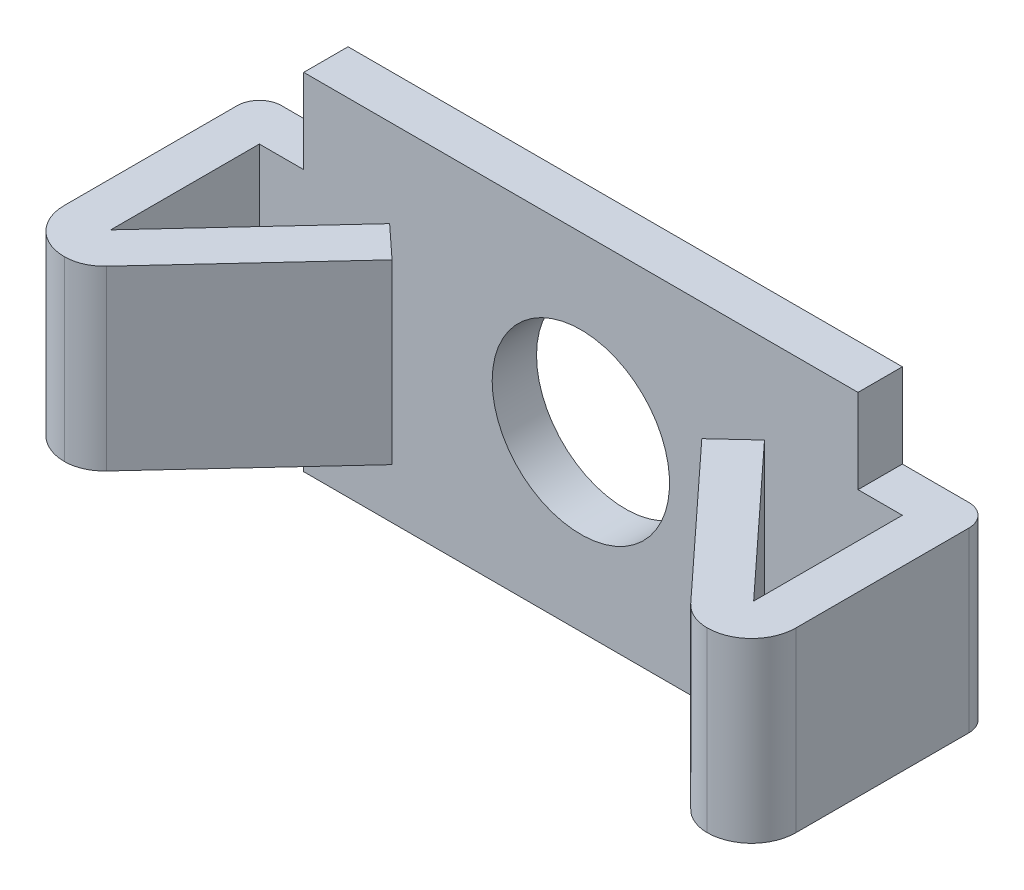
ISO-10303-21;
HEADER;
FILE_DESCRIPTION(('STEP AP214'),'2;1');
FILE_NAME('part.step','',(''),(''),'','','');
FILE_SCHEMA(('AUTOMOTIVE_DESIGN { 1 0 10303 214 1 1 1 1 }'));
ENDSEC;
DATA;
#1=APPLICATION_CONTEXT('core data for automotive mechanical design processes');
#2=APPLICATION_PROTOCOL_DEFINITION('international standard','automotive_design',2000,#1);
#3=PRODUCT_CONTEXT('',#1,'mechanical');
#4=PRODUCT('Part','Part','',(#3));
#5=PRODUCT_RELATED_PRODUCT_CATEGORY('part','',(#4));
#6=PRODUCT_DEFINITION_FORMATION('','',#4);
#7=PRODUCT_DEFINITION_CONTEXT('part definition',#1,'design');
#8=PRODUCT_DEFINITION('design','',#6,#7);
#9=PRODUCT_DEFINITION_SHAPE('','',#8);
#10=(LENGTH_UNIT() NAMED_UNIT(*) SI_UNIT(.MILLI.,.METRE.));
#11=(NAMED_UNIT(*) PLANE_ANGLE_UNIT() SI_UNIT($,.RADIAN.));
#12=(NAMED_UNIT(*) SI_UNIT($,.STERADIAN.) SOLID_ANGLE_UNIT());
#13=UNCERTAINTY_MEASURE_WITH_UNIT(LENGTH_MEASURE(1.E-05),#10,'distance_accuracy_value','');
#14=(GEOMETRIC_REPRESENTATION_CONTEXT(3) GLOBAL_UNCERTAINTY_ASSIGNED_CONTEXT((#13)) GLOBAL_UNIT_ASSIGNED_CONTEXT((#10,
#11,#12)) REPRESENTATION_CONTEXT('',''));
#15=CARTESIAN_POINT('',(0.,0.,0.));
#16=DIRECTION('',(0.,0.,1.));
#17=DIRECTION('',(1.,0.,0.));
#18=AXIS2_PLACEMENT_3D('',#15,#16,#17);
#19=CARTESIAN_POINT('',(14.5,4.,0.));
#20=DIRECTION('',(-1.,0.,0.));
#21=DIRECTION('',(0.,0.,-1.));
#22=AXIS2_PLACEMENT_3D('',#19,#20,#21);
#23=PLANE('',#22);
#24=DIRECTION('',(0.,0.,1.));
#25=VECTOR('',#24,1.);
#26=CARTESIAN_POINT('',(14.5,-4.,10.8));
#27=LINE('',#26,#25);
#28=CARTESIAN_POINT('',(14.5,-4.,2.));
#29=VERTEX_POINT('',#28);
#30=CARTESIAN_POINT('',(14.5,-4.,8.70715298939121));
#31=VERTEX_POINT('',#30);
#32=EDGE_CURVE('E255',#29,#31,#27,.T.);
#33=ORIENTED_EDGE('',*,*,#32,.T.);
#34=DIRECTION('',(0.,1.,0.));
#35=VECTOR('',#34,1.);
#36=CARTESIAN_POINT('',(14.5,-4.,8.70715298939121));
#37=LINE('',#36,#35);
#38=CARTESIAN_POINT('',(14.5,4.,8.70715298939121));
#39=VERTEX_POINT('',#38);
#40=EDGE_CURVE('E230',#31,#39,#37,.T.);
#41=ORIENTED_EDGE('',*,*,#40,.T.);
#42=DIRECTION('',(0.,0.,-1.));
#43=VECTOR('',#42,1.);
#44=CARTESIAN_POINT('',(14.5,4.,0.));
#45=LINE('',#44,#43);
#46=CARTESIAN_POINT('',(14.5,4.,2.));
#47=VERTEX_POINT('',#46);
#48=EDGE_CURVE('E248',#39,#47,#45,.T.);
#49=ORIENTED_EDGE('',*,*,#48,.T.);
#50=DIRECTION('',(0.,1.,0.));
#51=VECTOR('',#50,1.);
#52=CARTESIAN_POINT('',(14.5,7.8,2.));
#53=LINE('',#52,#51);
#54=EDGE_CURVE('E257',#29,#47,#53,.T.);
#55=ORIENTED_EDGE('',*,*,#54,.F.);
#56=EDGE_LOOP('',(#33,#41,#49,#55));
#57=FACE_BOUND('',#56,.T.);
#58=ADVANCED_FACE('F35',(#57),#23,.T.);
#59=CARTESIAN_POINT('',(16.5,-7.80000000000001,2.));
#60=DIRECTION('',(-1.,0.,0.));
#61=DIRECTION('',(0.,0.,1.));
#62=AXIS2_PLACEMENT_3D('',#59,#60,#61);
#63=PLANE('',#62);
#64=DIRECTION('',(0.,0.,1.));
#65=VECTOR('',#64,1.);
#66=CARTESIAN_POINT('',(16.5,-4.,0.));
#67=LINE('',#66,#65);
#68=CARTESIAN_POINT('',(16.5,-4.,1.));
#69=VERTEX_POINT('',#68);
#70=CARTESIAN_POINT('',(16.5,-4.,8.8));
#71=VERTEX_POINT('',#70);
#72=EDGE_CURVE('E314',#69,#71,#67,.T.);
#73=ORIENTED_EDGE('',*,*,#72,.F.);
#74=DIRECTION('',(0.,1.,0.));
#75=VECTOR('',#74,1.);
#76=CARTESIAN_POINT('',(16.5,4.,1.));
#77=LINE('',#76,#75);
#78=CARTESIAN_POINT('',(16.5,4.,1.));
#79=VERTEX_POINT('',#78);
#80=EDGE_CURVE('E404',#69,#79,#77,.T.);
#81=ORIENTED_EDGE('',*,*,#80,.T.);
#82=DIRECTION('',(0.,0.,1.));
#83=VECTOR('',#82,1.);
#84=CARTESIAN_POINT('',(16.5,4.,0.));
#85=LINE('',#84,#83);
#86=CARTESIAN_POINT('',(16.5,4.,8.8));
#87=VERTEX_POINT('',#86);
#88=EDGE_CURVE('E337',#79,#87,#85,.T.);
#89=ORIENTED_EDGE('',*,*,#88,.T.);
#90=DIRECTION('',(0.,1.,0.));
#91=VECTOR('',#90,1.);
#92=CARTESIAN_POINT('',(16.5,-7.80000000000001,8.8));
#93=LINE('',#92,#91);
#94=EDGE_CURVE('E391',#87,#71,#93,.F.);
#95=ORIENTED_EDGE('',*,*,#94,.T.);
#96=EDGE_LOOP('',(#73,#81,#89,#95));
#97=FACE_BOUND('',#96,.T.);
#98=ADVANCED_FACE('F488',(#97),#63,.F.);
#99=CARTESIAN_POINT('',(-16.5,7.8,2.));
#100=DIRECTION('',(0.,-1.,0.));
#101=DIRECTION('',(0.,0.,-1.));
#102=AXIS2_PLACEMENT_3D('',#99,#100,#101);
#103=PLANE('',#102);
#104=DIRECTION('',(-1.,0.,0.));
#105=VECTOR('',#104,1.);
#106=CARTESIAN_POINT('',(-16.5,7.8,2.));
#107=LINE('',#106,#105);
#108=CARTESIAN_POINT('',(12.5,7.8,2.));
#109=VERTEX_POINT('',#108);
#110=CARTESIAN_POINT('',(-12.5,7.8,2.));
#111=VERTEX_POINT('',#110);
#112=EDGE_CURVE('E379',#109,#111,#107,.T.);
#113=ORIENTED_EDGE('',*,*,#112,.F.);
#114=DIRECTION('',(0.,0.,1.));
#115=VECTOR('',#114,1.);
#116=CARTESIAN_POINT('',(12.5,7.8,0.));
#117=LINE('',#116,#115);
#118=CARTESIAN_POINT('',(12.5,7.8,0.));
#119=VERTEX_POINT('',#118);
#120=EDGE_CURVE('E332',#119,#109,#117,.T.);
#121=ORIENTED_EDGE('',*,*,#120,.F.);
#122=DIRECTION('',(-1.,0.,0.));
#123=VECTOR('',#122,1.);
#124=CARTESIAN_POINT('',(-16.5,7.8,0.));
#125=LINE('',#124,#123);
#126=CARTESIAN_POINT('',(-12.5,7.8,0.));
#127=VERTEX_POINT('',#126);
#128=EDGE_CURVE('E374',#119,#127,#125,.T.);
#129=ORIENTED_EDGE('',*,*,#128,.T.);
#130=DIRECTION('',(0.,0.,1.));
#131=VECTOR('',#130,1.);
#132=CARTESIAN_POINT('',(-12.5,7.8,0.));
#133=LINE('',#132,#131);
#134=EDGE_CURVE('E371',#127,#111,#133,.T.);
#135=ORIENTED_EDGE('',*,*,#134,.T.);
#136=EDGE_LOOP('',(#113,#121,#129,#135));
#137=FACE_BOUND('',#136,.T.);
#138=ADVANCED_FACE('F469',(#137),#103,.F.);
#139=CARTESIAN_POINT('',(-16.5,-7.80000000000001,2.));
#140=DIRECTION('',(1.,0.,0.));
#141=DIRECTION('',(0.,0.,-1.));
#142=AXIS2_PLACEMENT_3D('',#139,#140,#141);
#143=PLANE('',#142);
#144=DIRECTION('',(0.,0.,1.));
#145=VECTOR('',#144,1.);
#146=CARTESIAN_POINT('',(-16.5,4.,0.));
#147=LINE('',#146,#145);
#148=CARTESIAN_POINT('',(-16.5,4.,1.));
#149=VERTEX_POINT('',#148);
#150=CARTESIAN_POINT('',(-16.5,4.,8.8));
#151=VERTEX_POINT('',#150);
#152=EDGE_CURVE('E367',#149,#151,#147,.T.);
#153=ORIENTED_EDGE('',*,*,#152,.F.);
#154=DIRECTION('',(0.,-1.,0.));
#155=VECTOR('',#154,1.);
#156=CARTESIAN_POINT('',(-16.5,-4.,1.));
#157=LINE('',#156,#155);
#158=CARTESIAN_POINT('',(-16.5,-4.,1.));
#159=VERTEX_POINT('',#158);
#160=EDGE_CURVE('E415',#149,#159,#157,.T.);
#161=ORIENTED_EDGE('',*,*,#160,.T.);
#162=DIRECTION('',(0.,0.,1.));
#163=VECTOR('',#162,1.);
#164=CARTESIAN_POINT('',(-16.5,-4.,0.));
#165=LINE('',#164,#163);
#166=CARTESIAN_POINT('',(-16.5,-4.,8.8));
#167=VERTEX_POINT('',#166);
#168=EDGE_CURVE('E355',#159,#167,#165,.T.);
#169=ORIENTED_EDGE('',*,*,#168,.T.);
#170=DIRECTION('',(0.,1.,0.));
#171=VECTOR('',#170,1.);
#172=CARTESIAN_POINT('',(-16.5,4.,8.8));
#173=LINE('',#172,#171);
#174=EDGE_CURVE('E396',#167,#151,#173,.T.);
#175=ORIENTED_EDGE('',*,*,#174,.T.);
#176=EDGE_LOOP('',(#153,#161,#169,#175));
#177=FACE_BOUND('',#176,.T.);
#178=ADVANCED_FACE('F425',(#177),#143,.F.);
#179=CARTESIAN_POINT('',(-16.5,-7.80000000000001,2.));
#180=DIRECTION('',(0.,1.,0.));
#181=DIRECTION('',(0.,0.,1.));
#182=AXIS2_PLACEMENT_3D('',#179,#180,#181);
#183=PLANE('',#182);
#184=DIRECTION('',(1.,0.,0.));
#185=VECTOR('',#184,1.);
#186=CARTESIAN_POINT('',(-16.5,-7.80000000000001,0.));
#187=LINE('',#186,#185);
#188=CARTESIAN_POINT('',(-12.5,-7.80000000000001,0.));
#189=VERTEX_POINT('',#188);
#190=CARTESIAN_POINT('',(12.5,-7.80000000000001,0.));
#191=VERTEX_POINT('',#190);
#192=EDGE_CURVE('E382',#189,#191,#187,.T.);
#193=ORIENTED_EDGE('',*,*,#192,.T.);
#194=DIRECTION('',(0.,0.,1.));
#195=VECTOR('',#194,1.);
#196=CARTESIAN_POINT('',(12.5,-7.80000000000001,0.));
#197=LINE('',#196,#195);
#198=CARTESIAN_POINT('',(12.5,-7.80000000000001,2.));
#199=VERTEX_POINT('',#198);
#200=EDGE_CURVE('E317',#191,#199,#197,.T.);
#201=ORIENTED_EDGE('',*,*,#200,.T.);
#202=DIRECTION('',(1.,0.,0.));
#203=VECTOR('',#202,1.);
#204=CARTESIAN_POINT('',(-16.5,-7.80000000000001,2.));
#205=LINE('',#204,#203);
#206=CARTESIAN_POINT('',(-12.5,-7.80000000000001,2.));
#207=VERTEX_POINT('',#206);
#208=EDGE_CURVE('E381',#207,#199,#205,.T.);
#209=ORIENTED_EDGE('',*,*,#208,.F.);
#210=DIRECTION('',(0.,0.,1.));
#211=VECTOR('',#210,1.);
#212=CARTESIAN_POINT('',(-12.5,-7.80000000000001,0.));
#213=LINE('',#212,#211);
#214=EDGE_CURVE('E350',#189,#207,#213,.T.);
#215=ORIENTED_EDGE('',*,*,#214,.F.);
#216=EDGE_LOOP('',(#193,#201,#209,#215));
#217=FACE_BOUND('',#216,.T.);
#218=ADVANCED_FACE('F556',(#217),#183,.F.);
#219=CARTESIAN_POINT('',(16.5,7.8,2.));
#220=DIRECTION('',(0.,0.,-1.));
#221=DIRECTION('',(-1.,0.,0.));
#222=AXIS2_PLACEMENT_3D('',#219,#220,#221);
#223=PLANE('',#222);
#224=CARTESIAN_POINT('',(0.,0.,2.));
#225=DIRECTION('',(0.,0.,-1.));
#226=DIRECTION('',(-1.,0.,0.));
#227=AXIS2_PLACEMENT_3D('',#224,#225,#226);
#228=CIRCLE('',#227,4.);
#229=CARTESIAN_POINT('',(-4.,0.,2.));
#230=VERTEX_POINT('',#229);
#231=EDGE_CURVE('E263',#230,#230,#228,.T.);
#232=ORIENTED_EDGE('',*,*,#231,.T.);
#233=EDGE_LOOP('',(#232));
#234=FACE_BOUND('',#233,.T.);
#235=DIRECTION('',(-1.,0.,0.));
#236=VECTOR('',#235,1.);
#237=CARTESIAN_POINT('',(12.5,-4.,2.));
#238=LINE('',#237,#236);
#239=CARTESIAN_POINT('',(12.5,-4.,2.));
#240=VERTEX_POINT('',#239);
#241=EDGE_CURVE('E307',#29,#240,#238,.T.);
#242=ORIENTED_EDGE('',*,*,#241,.F.);
#243=ORIENTED_EDGE('',*,*,#54,.T.);
#244=DIRECTION('',(1.,0.,0.));
#245=VECTOR('',#244,1.);
#246=CARTESIAN_POINT('',(12.5,4.,2.));
#247=LINE('',#246,#245);
#248=CARTESIAN_POINT('',(12.5,4.,2.));
#249=VERTEX_POINT('',#248);
#250=EDGE_CURVE('E329',#249,#47,#247,.T.);
#251=ORIENTED_EDGE('',*,*,#250,.F.);
#252=DIRECTION('',(0.,-1.,0.));
#253=VECTOR('',#252,1.);
#254=CARTESIAN_POINT('',(12.5,7.8,2.));
#255=LINE('',#254,#253);
#256=EDGE_CURVE('E320',#109,#249,#255,.T.);
#257=ORIENTED_EDGE('',*,*,#256,.F.);
#258=ORIENTED_EDGE('',*,*,#112,.T.);
#259=DIRECTION('',(0.,1.,0.));
#260=VECTOR('',#259,1.);
#261=CARTESIAN_POINT('',(-12.5,7.8,2.));
#262=LINE('',#261,#260);
#263=CARTESIAN_POINT('',(-12.5,4.,2.));
#264=VERTEX_POINT('',#263);
#265=EDGE_CURVE('E364',#264,#111,#262,.T.);
#266=ORIENTED_EDGE('',*,*,#265,.F.);
#267=DIRECTION('',(1.,0.,0.));
#268=VECTOR('',#267,1.);
#269=CARTESIAN_POINT('',(-12.5,4.,2.));
#270=LINE('',#269,#268);
#271=CARTESIAN_POINT('',(-14.5,4.,2.));
#272=VERTEX_POINT('',#271);
#273=EDGE_CURVE('E357',#272,#264,#270,.T.);
#274=ORIENTED_EDGE('',*,*,#273,.F.);
#275=DIRECTION('',(0.,-1.,0.));
#276=VECTOR('',#275,1.);
#277=CARTESIAN_POINT('',(-14.5,7.8,2.));
#278=LINE('',#277,#276);
#279=CARTESIAN_POINT('',(-14.5,-4.,2.));
#280=VERTEX_POINT('',#279);
#281=EDGE_CURVE('E305',#272,#280,#278,.T.);
#282=ORIENTED_EDGE('',*,*,#281,.T.);
#283=DIRECTION('',(-1.,0.,0.));
#284=VECTOR('',#283,1.);
#285=CARTESIAN_POINT('',(-12.5,-4.,2.));
#286=LINE('',#285,#284);
#287=CARTESIAN_POINT('',(-12.5,-4.,2.));
#288=VERTEX_POINT('',#287);
#289=EDGE_CURVE('E347',#288,#280,#286,.T.);
#290=ORIENTED_EDGE('',*,*,#289,.F.);
#291=DIRECTION('',(0.,1.,0.));
#292=VECTOR('',#291,1.);
#293=CARTESIAN_POINT('',(-12.5,-4.,2.));
#294=LINE('',#293,#292);
#295=EDGE_CURVE('E339',#207,#288,#294,.T.);
#296=ORIENTED_EDGE('',*,*,#295,.F.);
#297=ORIENTED_EDGE('',*,*,#208,.T.);
#298=DIRECTION('',(0.,-1.,0.));
#299=VECTOR('',#298,1.);
#300=CARTESIAN_POINT('',(12.5,-4.,2.));
#301=LINE('',#300,#299);
#302=EDGE_CURVE('E311',#240,#199,#301,.T.);
#303=ORIENTED_EDGE('',*,*,#302,.F.);
#304=EDGE_LOOP('',(#242,#243,#251,#257,#258,#266,#274,#282,#290,#296,#297,#303));
#305=FACE_BOUND('',#304,.T.);
#306=ADVANCED_FACE('F456',(#234,#305),#223,.F.);
#307=CARTESIAN_POINT('',(16.5,7.8,0.));
#308=DIRECTION('',(0.,0.,-1.));
#309=DIRECTION('',(-1.,0.,0.));
#310=AXIS2_PLACEMENT_3D('',#307,#308,#309);
#311=PLANE('',#310);
#312=DIRECTION('',(1.,0.,0.));
#313=VECTOR('',#312,1.);
#314=CARTESIAN_POINT('',(12.5,4.,0.));
#315=LINE('',#314,#313);
#316=CARTESIAN_POINT('',(12.5,4.,0.));
#317=VERTEX_POINT('',#316);
#318=CARTESIAN_POINT('',(15.5,4.,0.));
#319=VERTEX_POINT('',#318);
#320=EDGE_CURVE('E328',#317,#319,#315,.T.);
#321=ORIENTED_EDGE('',*,*,#320,.T.);
#322=DIRECTION('',(0.,1.,0.));
#323=VECTOR('',#322,1.);
#324=CARTESIAN_POINT('',(15.5,-4.,0.));
#325=LINE('',#324,#323);
#326=CARTESIAN_POINT('',(15.5,-4.,0.));
#327=VERTEX_POINT('',#326);
#328=EDGE_CURVE('E411',#319,#327,#325,.F.);
#329=ORIENTED_EDGE('',*,*,#328,.T.);
#330=DIRECTION('',(-1.,0.,0.));
#331=VECTOR('',#330,1.);
#332=CARTESIAN_POINT('',(12.5,-4.,0.));
#333=LINE('',#332,#331);
#334=CARTESIAN_POINT('',(12.5,-4.,0.));
#335=VERTEX_POINT('',#334);
#336=EDGE_CURVE('E308',#327,#335,#333,.T.);
#337=ORIENTED_EDGE('',*,*,#336,.T.);
#338=DIRECTION('',(0.,-1.,0.));
#339=VECTOR('',#338,1.);
#340=CARTESIAN_POINT('',(12.5,-4.,0.));
#341=LINE('',#340,#339);
#342=EDGE_CURVE('E310',#335,#191,#341,.T.);
#343=ORIENTED_EDGE('',*,*,#342,.T.);
#344=ORIENTED_EDGE('',*,*,#192,.F.);
#345=DIRECTION('',(0.,1.,0.));
#346=VECTOR('',#345,1.);
#347=CARTESIAN_POINT('',(-12.5,-4.,0.));
#348=LINE('',#347,#346);
#349=CARTESIAN_POINT('',(-12.5,-4.,0.));
#350=VERTEX_POINT('',#349);
#351=EDGE_CURVE('E343',#189,#350,#348,.T.);
#352=ORIENTED_EDGE('',*,*,#351,.T.);
#353=DIRECTION('',(-1.,0.,0.));
#354=VECTOR('',#353,1.);
#355=CARTESIAN_POINT('',(-12.5,-4.,0.));
#356=LINE('',#355,#354);
#357=CARTESIAN_POINT('',(-15.5,-4.,0.));
#358=VERTEX_POINT('',#357);
#359=EDGE_CURVE('E346',#350,#358,#356,.T.);
#360=ORIENTED_EDGE('',*,*,#359,.T.);
#361=DIRECTION('',(0.,-1.,0.));
#362=VECTOR('',#361,1.);
#363=CARTESIAN_POINT('',(-15.5,4.,0.));
#364=LINE('',#363,#362);
#365=CARTESIAN_POINT('',(-15.5,4.,0.));
#366=VERTEX_POINT('',#365);
#367=EDGE_CURVE('E409',#358,#366,#364,.F.);
#368=ORIENTED_EDGE('',*,*,#367,.T.);
#369=DIRECTION('',(1.,0.,0.));
#370=VECTOR('',#369,1.);
#371=CARTESIAN_POINT('',(-12.5,4.,0.));
#372=LINE('',#371,#370);
#373=CARTESIAN_POINT('',(-12.5,4.,0.));
#374=VERTEX_POINT('',#373);
#375=EDGE_CURVE('E361',#366,#374,#372,.T.);
#376=ORIENTED_EDGE('',*,*,#375,.T.);
#377=DIRECTION('',(0.,1.,0.));
#378=VECTOR('',#377,1.);
#379=CARTESIAN_POINT('',(-12.5,7.8,0.));
#380=LINE('',#379,#378);
#381=EDGE_CURVE('E363',#374,#127,#380,.T.);
#382=ORIENTED_EDGE('',*,*,#381,.T.);
#383=ORIENTED_EDGE('',*,*,#128,.F.);
#384=DIRECTION('',(0.,-1.,0.));
#385=VECTOR('',#384,1.);
#386=CARTESIAN_POINT('',(12.5,7.8,0.));
#387=LINE('',#386,#385);
#388=EDGE_CURVE('E325',#119,#317,#387,.T.);
#389=ORIENTED_EDGE('',*,*,#388,.T.);
#390=EDGE_LOOP('',(#321,#329,#337,#343,#344,#352,#360,#368,#376,#382,#383,#389));
#391=FACE_BOUND('',#390,.T.);
#392=CARTESIAN_POINT('',(0.,0.,0.));
#393=DIRECTION('',(0.,0.,-1.));
#394=DIRECTION('',(-1.,0.,0.));
#395=AXIS2_PLACEMENT_3D('',#392,#393,#394);
#396=CIRCLE('',#395,4.);
#397=CARTESIAN_POINT('',(-4.,0.,0.));
#398=VERTEX_POINT('',#397);
#399=EDGE_CURVE('E260',#398,#398,#396,.T.);
#400=ORIENTED_EDGE('',*,*,#399,.F.);
#401=EDGE_LOOP('',(#400));
#402=FACE_BOUND('',#401,.T.);
#403=ADVANCED_FACE('F421',(#391,#402),#311,.T.);
#404=CARTESIAN_POINT('',(-12.5,7.8,0.));
#405=DIRECTION('',(1.,0.,0.));
#406=DIRECTION('',(0.,0.,-1.));
#407=AXIS2_PLACEMENT_3D('',#404,#405,#406);
#408=PLANE('',#407);
#409=ORIENTED_EDGE('',*,*,#265,.T.);
#410=ORIENTED_EDGE('',*,*,#134,.F.);
#411=ORIENTED_EDGE('',*,*,#381,.F.);
#412=DIRECTION('',(0.,0.,1.));
#413=VECTOR('',#412,1.);
#414=CARTESIAN_POINT('',(-12.5,4.,0.));
#415=LINE('',#414,#413);
#416=EDGE_CURVE('E375',#374,#264,#415,.T.);
#417=ORIENTED_EDGE('',*,*,#416,.T.);
#418=EDGE_LOOP('',(#409,#410,#411,#417));
#419=FACE_BOUND('',#418,.T.);
#420=ADVANCED_FACE('F463',(#419),#408,.F.);
#421=CARTESIAN_POINT('',(-12.5,4.,0.));
#422=DIRECTION('',(0.,-1.,0.));
#423=DIRECTION('',(0.,0.,-1.));
#424=AXIS2_PLACEMENT_3D('',#421,#422,#423);
#425=PLANE('',#424);
#426=ORIENTED_EDGE('',*,*,#375,.F.);
#427=CARTESIAN_POINT('',(-15.5,4.,1.));
#428=DIRECTION('',(0.,-1.,0.));
#429=DIRECTION('',(0.,0.,-1.));
#430=AXIS2_PLACEMENT_3D('',#427,#428,#429);
#431=CIRCLE('',#430,1.);
#432=EDGE_CURVE('E11',#366,#149,#431,.F.);
#433=ORIENTED_EDGE('',*,*,#432,.T.);
#434=ORIENTED_EDGE('',*,*,#152,.T.);
#435=CARTESIAN_POINT('',(-14.5,4.,8.8));
#436=DIRECTION('',(0.,-1.,0.));
#437=DIRECTION('',(0.,0.,-1.));
#438=AXIS2_PLACEMENT_3D('',#435,#436,#437);
#439=CIRCLE('',#438,2.);
#440=CARTESIAN_POINT('',(-14.5,4.,10.8));
#441=VERTEX_POINT('',#440);
#442=EDGE_CURVE('E399',#151,#441,#439,.F.);
#443=ORIENTED_EDGE('',*,*,#442,.T.);
#444=CARTESIAN_POINT('',(-14.5,4.,8.99650003438803));
#445=DIRECTION('',(0.,1.,0.));
#446=DIRECTION('',(0.,0.,1.));
#447=AXIS2_PLACEMENT_3D('',#444,#445,#446);
#448=CIRCLE('',#447,1.80349996561198);
#449=CARTESIAN_POINT('',(-13.1721603342825,4.,10.2169319038955));
#450=VERTEX_POINT('',#449);
#451=EDGE_CURVE('E266',#441,#450,#448,.T.);
#452=ORIENTED_EDGE('',*,*,#451,.T.);
#453=DIRECTION('',(0.679149961217638,0.,-0.733999543717897));
#454=VECTOR('',#453,1.);
#455=CARTESIAN_POINT('',(-6.98527906210758,4.,3.53038505837795));
#456=LINE('',#455,#454);
#457=CARTESIAN_POINT('',(-6.98527906210758,4.,3.53038505837795));
#458=VERTEX_POINT('',#457);
#459=EDGE_CURVE('E282',#450,#458,#456,.T.);
#460=ORIENTED_EDGE('',*,*,#459,.T.);
#461=DIRECTION('',(-0.733999543717897,0.,-0.679149961217638));
#462=VECTOR('',#461,1.);
#463=CARTESIAN_POINT('',(-8.45327814954337,4.,2.17208513594267));
#464=LINE('',#463,#462);
#465=CARTESIAN_POINT('',(-8.45327814954337,4.,2.17208513594267));
#466=VERTEX_POINT('',#465);
#467=EDGE_CURVE('E285',#458,#466,#464,.T.);
#468=ORIENTED_EDGE('',*,*,#467,.T.);
#469=DIRECTION('',(-0.679149961217638,0.,0.733999543717897));
#470=VECTOR('',#469,1.);
#471=CARTESIAN_POINT('',(-8.45327814954337,4.,2.17208513594267));
#472=LINE('',#471,#470);
#473=CARTESIAN_POINT('',(-14.5,4.,8.70715298939121));
#474=VERTEX_POINT('',#473);
#475=EDGE_CURVE('E271',#466,#474,#472,.T.);
#476=ORIENTED_EDGE('',*,*,#475,.T.);
#477=DIRECTION('',(0.,0.,-1.));
#478=VECTOR('',#477,1.);
#479=CARTESIAN_POINT('',(-14.5,4.,0.));
#480=LINE('',#479,#478);
#481=EDGE_CURVE('E303',#474,#272,#480,.T.);
#482=ORIENTED_EDGE('',*,*,#481,.T.);
#483=ORIENTED_EDGE('',*,*,#273,.T.);
#484=ORIENTED_EDGE('',*,*,#416,.F.);
#485=EDGE_LOOP('',(#426,#433,#434,#443,#452,#460,#468,#476,#482,#483,#484));
#486=FACE_BOUND('',#485,.T.);
#487=ADVANCED_FACE('F428',(#486),#425,.F.);
#488=CARTESIAN_POINT('',(-12.5,-4.,0.));
#489=DIRECTION('',(0.,1.,0.));
#490=DIRECTION('',(0.,0.,1.));
#491=AXIS2_PLACEMENT_3D('',#488,#489,#490);
#492=PLANE('',#491);
#493=ORIENTED_EDGE('',*,*,#168,.F.);
#494=CARTESIAN_POINT('',(-15.5,-4.,1.));
#495=DIRECTION('',(0.,1.,0.));
#496=DIRECTION('',(0.,0.,1.));
#497=AXIS2_PLACEMENT_3D('',#494,#495,#496);
#498=CIRCLE('',#497,1.);
#499=EDGE_CURVE('E43',#159,#358,#498,.F.);
#500=ORIENTED_EDGE('',*,*,#499,.T.);
#501=ORIENTED_EDGE('',*,*,#359,.F.);
#502=DIRECTION('',(0.,0.,1.));
#503=VECTOR('',#502,1.);
#504=CARTESIAN_POINT('',(-12.5,-4.,0.));
#505=LINE('',#504,#503);
#506=EDGE_CURVE('E358',#350,#288,#505,.T.);
#507=ORIENTED_EDGE('',*,*,#506,.T.);
#508=ORIENTED_EDGE('',*,*,#289,.T.);
#509=DIRECTION('',(0.,0.,1.));
#510=VECTOR('',#509,1.);
#511=CARTESIAN_POINT('',(-14.5,-4.,10.8));
#512=LINE('',#511,#510);
#513=CARTESIAN_POINT('',(-14.5,-4.,8.70715298939121));
#514=VERTEX_POINT('',#513);
#515=EDGE_CURVE('E292',#280,#514,#512,.T.);
#516=ORIENTED_EDGE('',*,*,#515,.T.);
#517=DIRECTION('',(-0.679149961217638,0.,0.733999543717897));
#518=VECTOR('',#517,1.);
#519=CARTESIAN_POINT('',(-8.45327814954337,-4.,2.17208513594267));
#520=LINE('',#519,#518);
#521=CARTESIAN_POINT('',(-8.45327814954337,-4.,2.17208513594267));
#522=VERTEX_POINT('',#521);
#523=EDGE_CURVE('E277',#522,#514,#520,.T.);
#524=ORIENTED_EDGE('',*,*,#523,.F.);
#525=DIRECTION('',(-0.733999543717897,0.,-0.679149961217638));
#526=VECTOR('',#525,1.);
#527=CARTESIAN_POINT('',(-8.45327814954337,-4.,2.17208513594267));
#528=LINE('',#527,#526);
#529=CARTESIAN_POINT('',(-6.98527906210758,-4.,3.53038505837795));
#530=VERTEX_POINT('',#529);
#531=EDGE_CURVE('E274',#530,#522,#528,.T.);
#532=ORIENTED_EDGE('',*,*,#531,.F.);
#533=DIRECTION('',(0.679149961217638,0.,-0.733999543717897));
#534=VECTOR('',#533,1.);
#535=CARTESIAN_POINT('',(-6.98527906210758,-4.,3.53038505837795));
#536=LINE('',#535,#534);
#537=CARTESIAN_POINT('',(-13.1721603342825,-4.,10.2169319038955));
#538=VERTEX_POINT('',#537);
#539=EDGE_CURVE('E270',#538,#530,#536,.T.);
#540=ORIENTED_EDGE('',*,*,#539,.F.);
#541=CARTESIAN_POINT('',(-14.5,-4.,8.99650003438803));
#542=DIRECTION('',(0.,1.,0.));
#543=DIRECTION('',(0.,0.,1.));
#544=AXIS2_PLACEMENT_3D('',#541,#542,#543);
#545=CIRCLE('',#544,1.80349996561198);
#546=CARTESIAN_POINT('',(-14.5,-4.,10.8));
#547=VERTEX_POINT('',#546);
#548=EDGE_CURVE('E267',#547,#538,#545,.T.);
#549=ORIENTED_EDGE('',*,*,#548,.F.);
#550=CARTESIAN_POINT('',(-14.5,-4.,8.8));
#551=DIRECTION('',(0.,1.,0.));
#552=DIRECTION('',(0.,0.,1.));
#553=AXIS2_PLACEMENT_3D('',#550,#551,#552);
#554=CIRCLE('',#553,2.);
#555=EDGE_CURVE('E401',#547,#167,#554,.F.);
#556=ORIENTED_EDGE('',*,*,#555,.T.);
#557=EDGE_LOOP('',(#493,#500,#501,#507,#508,#516,#524,#532,#540,#549,#556));
#558=FACE_BOUND('',#557,.T.);
#559=ADVANCED_FACE('F418',(#558),#492,.F.);
#560=CARTESIAN_POINT('',(-12.5,-4.,0.));
#561=DIRECTION('',(1.,0.,0.));
#562=DIRECTION('',(0.,0.,-1.));
#563=AXIS2_PLACEMENT_3D('',#560,#561,#562);
#564=PLANE('',#563);
#565=ORIENTED_EDGE('',*,*,#295,.T.);
#566=ORIENTED_EDGE('',*,*,#506,.F.);
#567=ORIENTED_EDGE('',*,*,#351,.F.);
#568=ORIENTED_EDGE('',*,*,#214,.T.);
#569=EDGE_LOOP('',(#565,#566,#567,#568));
#570=FACE_BOUND('',#569,.T.);
#571=ADVANCED_FACE('F542',(#570),#564,.F.);
#572=CARTESIAN_POINT('',(12.5,4.,0.));
#573=DIRECTION('',(0.,-1.,0.));
#574=DIRECTION('',(0.,0.,-1.));
#575=AXIS2_PLACEMENT_3D('',#572,#573,#574);
#576=PLANE('',#575);
#577=ORIENTED_EDGE('',*,*,#88,.F.);
#578=CARTESIAN_POINT('',(15.5,4.,1.));
#579=DIRECTION('',(0.,-1.,0.));
#580=DIRECTION('',(0.,0.,-1.));
#581=AXIS2_PLACEMENT_3D('',#578,#579,#580);
#582=CIRCLE('',#581,1.);
#583=EDGE_CURVE('E407',#79,#319,#582,.F.);
#584=ORIENTED_EDGE('',*,*,#583,.T.);
#585=ORIENTED_EDGE('',*,*,#320,.F.);
#586=DIRECTION('',(0.,0.,1.));
#587=VECTOR('',#586,1.);
#588=CARTESIAN_POINT('',(12.5,4.,0.));
#589=LINE('',#588,#587);
#590=EDGE_CURVE('E340',#317,#249,#589,.T.);
#591=ORIENTED_EDGE('',*,*,#590,.T.);
#592=ORIENTED_EDGE('',*,*,#250,.T.);
#593=ORIENTED_EDGE('',*,*,#48,.F.);
#594=DIRECTION('',(0.679149961217638,0.,0.733999543717897));
#595=VECTOR('',#594,1.);
#596=CARTESIAN_POINT('',(8.45327814954337,4.,2.17208513594267));
#597=LINE('',#596,#595);
#598=CARTESIAN_POINT('',(8.45327814954337,4.,2.17208513594267));
#599=VERTEX_POINT('',#598);
#600=EDGE_CURVE('E241',#599,#39,#597,.T.);
#601=ORIENTED_EDGE('',*,*,#600,.F.);
#602=DIRECTION('',(0.733999543717897,0.,-0.679149961217638));
#603=VECTOR('',#602,1.);
#604=CARTESIAN_POINT('',(8.45327814954337,4.,2.17208513594267));
#605=LINE('',#604,#603);
#606=CARTESIAN_POINT('',(6.98527906210758,4.,3.53038505837795));
#607=VERTEX_POINT('',#606);
#608=EDGE_CURVE('E225',#607,#599,#605,.T.);
#609=ORIENTED_EDGE('',*,*,#608,.F.);
#610=DIRECTION('',(-0.679149961217638,0.,-0.733999543717897));
#611=VECTOR('',#610,1.);
#612=CARTESIAN_POINT('',(6.98527906210758,4.,3.53038505837795));
#613=LINE('',#612,#611);
#614=CARTESIAN_POINT('',(13.1721603342825,4.,10.2169319038955));
#615=VERTEX_POINT('',#614);
#616=EDGE_CURVE('E235',#615,#607,#613,.T.);
#617=ORIENTED_EDGE('',*,*,#616,.F.);
#618=CARTESIAN_POINT('',(14.5,4.,8.99650003438803));
#619=DIRECTION('',(0.,-1.,0.));
#620=DIRECTION('',(0.,0.,1.));
#621=AXIS2_PLACEMENT_3D('',#618,#619,#620);
#622=CIRCLE('',#621,1.80349996561198);
#623=CARTESIAN_POINT('',(14.5,4.,10.8));
#624=VERTEX_POINT('',#623);
#625=EDGE_CURVE('E233',#624,#615,#622,.T.);
#626=ORIENTED_EDGE('',*,*,#625,.F.);
#627=CARTESIAN_POINT('',(14.5,4.,8.8));
#628=DIRECTION('',(0.,-1.,0.));
#629=DIRECTION('',(0.,0.,-1.));
#630=AXIS2_PLACEMENT_3D('',#627,#628,#629);
#631=CIRCLE('',#630,2.);
#632=EDGE_CURVE('E385',#624,#87,#631,.F.);
#633=ORIENTED_EDGE('',*,*,#632,.T.);
#634=EDGE_LOOP('',(#577,#584,#585,#591,#592,#593,#601,#609,#617,#626,#633));
#635=FACE_BOUND('',#634,.T.);
#636=ADVANCED_FACE('F479',(#635),#576,.F.);
#637=CARTESIAN_POINT('',(12.5,7.8,0.));
#638=DIRECTION('',(-1.,0.,0.));
#639=DIRECTION('',(0.,0.,1.));
#640=AXIS2_PLACEMENT_3D('',#637,#638,#639);
#641=PLANE('',#640);
#642=ORIENTED_EDGE('',*,*,#256,.T.);
#643=ORIENTED_EDGE('',*,*,#590,.F.);
#644=ORIENTED_EDGE('',*,*,#388,.F.);
#645=ORIENTED_EDGE('',*,*,#120,.T.);
#646=EDGE_LOOP('',(#642,#643,#644,#645));
#647=FACE_BOUND('',#646,.T.);
#648=ADVANCED_FACE('F472',(#647),#641,.F.);
#649=CARTESIAN_POINT('',(12.5,-4.,0.));
#650=DIRECTION('',(-1.,0.,0.));
#651=DIRECTION('',(0.,0.,1.));
#652=AXIS2_PLACEMENT_3D('',#649,#650,#651);
#653=PLANE('',#652);
#654=ORIENTED_EDGE('',*,*,#302,.T.);
#655=ORIENTED_EDGE('',*,*,#200,.F.);
#656=ORIENTED_EDGE('',*,*,#342,.F.);
#657=DIRECTION('',(0.,0.,1.));
#658=VECTOR('',#657,1.);
#659=CARTESIAN_POINT('',(12.5,-4.,0.));
#660=LINE('',#659,#658);
#661=EDGE_CURVE('E321',#335,#240,#660,.T.);
#662=ORIENTED_EDGE('',*,*,#661,.T.);
#663=EDGE_LOOP('',(#654,#655,#656,#662));
#664=FACE_BOUND('',#663,.T.);
#665=ADVANCED_FACE('F534',(#664),#653,.F.);
#666=CARTESIAN_POINT('',(12.5,-4.,0.));
#667=DIRECTION('',(0.,1.,0.));
#668=DIRECTION('',(0.,0.,1.));
#669=AXIS2_PLACEMENT_3D('',#666,#667,#668);
#670=PLANE('',#669);
#671=ORIENTED_EDGE('',*,*,#336,.F.);
#672=CARTESIAN_POINT('',(15.5,-4.,1.));
#673=DIRECTION('',(0.,1.,0.));
#674=DIRECTION('',(0.,0.,1.));
#675=AXIS2_PLACEMENT_3D('',#672,#673,#674);
#676=CIRCLE('',#675,1.);
#677=EDGE_CURVE('E413',#327,#69,#676,.F.);
#678=ORIENTED_EDGE('',*,*,#677,.T.);
#679=ORIENTED_EDGE('',*,*,#72,.T.);
#680=CARTESIAN_POINT('',(14.5,-4.,8.8));
#681=DIRECTION('',(0.,1.,0.));
#682=DIRECTION('',(0.,0.,1.));
#683=AXIS2_PLACEMENT_3D('',#680,#681,#682);
#684=CIRCLE('',#683,2.);
#685=CARTESIAN_POINT('',(14.5,-4.,10.8));
#686=VERTEX_POINT('',#685);
#687=EDGE_CURVE('E394',#71,#686,#684,.F.);
#688=ORIENTED_EDGE('',*,*,#687,.T.);
#689=CARTESIAN_POINT('',(14.5,-4.,8.99650003438803));
#690=DIRECTION('',(0.,-1.,0.));
#691=DIRECTION('',(0.,0.,1.));
#692=AXIS2_PLACEMENT_3D('',#689,#690,#691);
#693=CIRCLE('',#692,1.80349996561198);
#694=CARTESIAN_POINT('',(13.1721603342825,-4.,10.2169319038955));
#695=VERTEX_POINT('',#694);
#696=EDGE_CURVE('E239',#686,#695,#693,.T.);
#697=ORIENTED_EDGE('',*,*,#696,.T.);
#698=DIRECTION('',(-0.679149961217638,0.,-0.733999543717897));
#699=VECTOR('',#698,1.);
#700=CARTESIAN_POINT('',(6.98527906210758,-4.,3.53038505837795));
#701=LINE('',#700,#699);
#702=CARTESIAN_POINT('',(6.98527906210758,-4.,3.53038505837795));
#703=VERTEX_POINT('',#702);
#704=EDGE_CURVE('E216',#695,#703,#701,.T.);
#705=ORIENTED_EDGE('',*,*,#704,.T.);
#706=DIRECTION('',(0.733999543717897,0.,-0.679149961217638));
#707=VECTOR('',#706,1.);
#708=CARTESIAN_POINT('',(8.45327814954337,-4.,2.17208513594267));
#709=LINE('',#708,#707);
#710=CARTESIAN_POINT('',(8.45327814954337,-4.,2.17208513594267));
#711=VERTEX_POINT('',#710);
#712=EDGE_CURVE('E207',#703,#711,#709,.T.);
#713=ORIENTED_EDGE('',*,*,#712,.T.);
#714=DIRECTION('',(0.679149961217638,0.,0.733999543717897));
#715=VECTOR('',#714,1.);
#716=CARTESIAN_POINT('',(8.45327814954337,-4.,2.17208513594267));
#717=LINE('',#716,#715);
#718=EDGE_CURVE('E213',#711,#31,#717,.T.);
#719=ORIENTED_EDGE('',*,*,#718,.T.);
#720=ORIENTED_EDGE('',*,*,#32,.F.);
#721=ORIENTED_EDGE('',*,*,#241,.T.);
#722=ORIENTED_EDGE('',*,*,#661,.F.);
#723=EDGE_LOOP('',(#671,#678,#679,#688,#697,#705,#713,#719,#720,#721,#722));
#724=FACE_BOUND('',#723,.T.);
#725=ADVANCED_FACE('F210',(#724),#670,.F.);
#726=CARTESIAN_POINT('',(-14.5,4.,0.));
#727=DIRECTION('',(1.,0.,0.));
#728=DIRECTION('',(0.,0.,-1.));
#729=AXIS2_PLACEMENT_3D('',#726,#727,#728);
#730=PLANE('',#729);
#731=DIRECTION('',(0.,1.,0.));
#732=VECTOR('',#731,1.);
#733=CARTESIAN_POINT('',(-14.5,-4.,8.70715298939121));
#734=LINE('',#733,#732);
#735=EDGE_CURVE('E290',#514,#474,#734,.T.);
#736=ORIENTED_EDGE('',*,*,#735,.F.);
#737=ORIENTED_EDGE('',*,*,#515,.F.);
#738=ORIENTED_EDGE('',*,*,#281,.F.);
#739=ORIENTED_EDGE('',*,*,#481,.F.);
#740=EDGE_LOOP('',(#736,#737,#738,#739));
#741=FACE_BOUND('',#740,.T.);
#742=ADVANCED_FACE('F451',(#741),#730,.T.);
#743=CARTESIAN_POINT('',(-8.45327814954337,-4.,2.17208513594267));
#744=DIRECTION('',(-0.733999543717897,0.,-0.679149961217638));
#745=DIRECTION('',(-0.679149961217638,0.,0.733999543717897));
#746=AXIS2_PLACEMENT_3D('',#743,#744,#745);
#747=PLANE('',#746);
#748=ORIENTED_EDGE('',*,*,#475,.F.);
#749=DIRECTION('',(0.,1.,0.));
#750=VECTOR('',#749,1.);
#751=CARTESIAN_POINT('',(-8.45327814954337,-4.,2.17208513594267));
#752=LINE('',#751,#750);
#753=EDGE_CURVE('E293',#522,#466,#752,.T.);
#754=ORIENTED_EDGE('',*,*,#753,.F.);
#755=ORIENTED_EDGE('',*,*,#523,.T.);
#756=ORIENTED_EDGE('',*,*,#735,.T.);
#757=EDGE_LOOP('',(#748,#754,#755,#756));
#758=FACE_BOUND('',#757,.T.);
#759=ADVANCED_FACE('F447',(#758),#747,.T.);
#760=CARTESIAN_POINT('',(-8.45327814954337,-4.,2.17208513594267));
#761=DIRECTION('',(0.679149961217638,0.,-0.733999543717897));
#762=DIRECTION('',(-0.733999543717897,0.,-0.679149961217638));
#763=AXIS2_PLACEMENT_3D('',#760,#761,#762);
#764=PLANE('',#763);
#765=ORIENTED_EDGE('',*,*,#467,.F.);
#766=DIRECTION('',(0.,1.,0.));
#767=VECTOR('',#766,1.);
#768=CARTESIAN_POINT('',(-6.98527906210758,-4.,3.53038505837795));
#769=LINE('',#768,#767);
#770=EDGE_CURVE('E295',#530,#458,#769,.T.);
#771=ORIENTED_EDGE('',*,*,#770,.F.);
#772=ORIENTED_EDGE('',*,*,#531,.T.);
#773=ORIENTED_EDGE('',*,*,#753,.T.);
#774=EDGE_LOOP('',(#765,#771,#772,#773));
#775=FACE_BOUND('',#774,.T.);
#776=ADVANCED_FACE('F525',(#775),#764,.T.);
#777=CARTESIAN_POINT('',(-6.98527906210758,-4.,3.53038505837795));
#778=DIRECTION('',(0.733999543717897,0.,0.679149961217638));
#779=DIRECTION('',(0.679149961217638,0.,-0.733999543717897));
#780=AXIS2_PLACEMENT_3D('',#777,#778,#779);
#781=PLANE('',#780);
#782=ORIENTED_EDGE('',*,*,#459,.F.);
#783=DIRECTION('',(0.,1.,0.));
#784=VECTOR('',#783,1.);
#785=CARTESIAN_POINT('',(-13.1721603342825,-4.,10.2169319038955));
#786=LINE('',#785,#784);
#787=EDGE_CURVE('E279',#538,#450,#786,.T.);
#788=ORIENTED_EDGE('',*,*,#787,.F.);
#789=ORIENTED_EDGE('',*,*,#539,.T.);
#790=ORIENTED_EDGE('',*,*,#770,.T.);
#791=EDGE_LOOP('',(#782,#788,#789,#790));
#792=FACE_BOUND('',#791,.T.);
#793=ADVANCED_FACE('F441',(#792),#781,.T.);
#794=CARTESIAN_POINT('',(-14.5,-4.,8.99650003438803));
#795=DIRECTION('',(0.,1.,0.));
#796=DIRECTION('',(0.,0.,1.));
#797=AXIS2_PLACEMENT_3D('',#794,#795,#796);
#798=CYLINDRICAL_SURFACE('',#797,1.80349996561198);
#799=ORIENTED_EDGE('',*,*,#451,.F.);
#800=DIRECTION('',(0.,1.,0.));
#801=VECTOR('',#800,1.);
#802=CARTESIAN_POINT('',(-14.5,4.,10.8));
#803=LINE('',#802,#801);
#804=EDGE_CURVE('E300',#547,#441,#803,.T.);
#805=ORIENTED_EDGE('',*,*,#804,.F.);
#806=ORIENTED_EDGE('',*,*,#548,.T.);
#807=ORIENTED_EDGE('',*,*,#787,.T.);
#808=EDGE_LOOP('',(#799,#805,#806,#807));
#809=FACE_BOUND('',#808,.T.);
#810=ADVANCED_FACE('F435',(#809),#798,.T.);
#811=CARTESIAN_POINT('',(0.,0.,10.8));
#812=DIRECTION('',(0.,0.,-1.));
#813=DIRECTION('',(-1.,0.,0.));
#814=AXIS2_PLACEMENT_3D('',#811,#812,#813);
#815=CYLINDRICAL_SURFACE('',#814,4.);
#816=CARTESIAN_POINT('',(-4.,0.,0.));
#817=CARTESIAN_POINT('',(-4.,0.,0.0208333333333333));
#818=CARTESIAN_POINT('',(-4.,0.,0.0416666666666667));
#819=CARTESIAN_POINT('',(-4.,0.,0.0833333333333334));
#820=CARTESIAN_POINT('',(-4.,0.,0.104166666666667));
#821=CARTESIAN_POINT('',(-4.,0.,0.145833333333333));
#822=CARTESIAN_POINT('',(-4.,0.,0.166666666666667));
#823=CARTESIAN_POINT('',(-4.,0.,0.208333333333334));
#824=CARTESIAN_POINT('',(-4.,0.,0.229166666666667));
#825=CARTESIAN_POINT('',(-4.,0.,0.270833333333334));
#826=CARTESIAN_POINT('',(-4.,0.,0.291666666666667));
#827=CARTESIAN_POINT('',(-4.,0.,0.333333333333334));
#828=CARTESIAN_POINT('',(-4.,0.,0.354166666666667));
#829=CARTESIAN_POINT('',(-4.,0.,0.395833333333334));
#830=CARTESIAN_POINT('',(-4.,0.,0.416666666666667));
#831=CARTESIAN_POINT('',(-4.,0.,0.458333333333334));
#832=CARTESIAN_POINT('',(-4.,0.,0.479166666666667));
#833=CARTESIAN_POINT('',(-4.,0.,0.520833333333334));
#834=CARTESIAN_POINT('',(-4.,0.,0.541666666666667));
#835=CARTESIAN_POINT('',(-4.,0.,0.583333333333334));
#836=CARTESIAN_POINT('',(-4.,0.,0.604166666666667));
#837=CARTESIAN_POINT('',(-4.,0.,0.645833333333334));
#838=CARTESIAN_POINT('',(-4.,0.,0.666666666666667));
#839=CARTESIAN_POINT('',(-4.,0.,0.708333333333334));
#840=CARTESIAN_POINT('',(-4.,0.,0.729166666666667));
#841=CARTESIAN_POINT('',(-4.,0.,0.770833333333334));
#842=CARTESIAN_POINT('',(-4.,0.,0.791666666666667));
#843=CARTESIAN_POINT('',(-4.,0.,0.833333333333334));
#844=CARTESIAN_POINT('',(-4.,0.,0.854166666666667));
#845=CARTESIAN_POINT('',(-4.,0.,0.895833333333334));
#846=CARTESIAN_POINT('',(-4.,0.,0.916666666666668));
#847=CARTESIAN_POINT('',(-4.,0.,0.958333333333334));
#848=CARTESIAN_POINT('',(-4.,0.,0.979166666666668));
#849=CARTESIAN_POINT('',(-4.,0.,1.02083333333333));
#850=CARTESIAN_POINT('',(-4.,0.,1.04166666666667));
#851=CARTESIAN_POINT('',(-4.,0.,1.08333333333333));
#852=CARTESIAN_POINT('',(-4.,0.,1.10416666666667));
#853=CARTESIAN_POINT('',(-4.,0.,1.14583333333333));
#854=CARTESIAN_POINT('',(-4.,0.,1.16666666666667));
#855=CARTESIAN_POINT('',(-4.,0.,1.20833333333333));
#856=CARTESIAN_POINT('',(-4.,0.,1.22916666666667));
#857=CARTESIAN_POINT('',(-4.,0.,1.27083333333333));
#858=CARTESIAN_POINT('',(-4.,0.,1.29166666666667));
#859=CARTESIAN_POINT('',(-4.,0.,1.33333333333333));
#860=CARTESIAN_POINT('',(-4.,0.,1.35416666666667));
#861=CARTESIAN_POINT('',(-4.,0.,1.39583333333333));
#862=CARTESIAN_POINT('',(-4.,0.,1.41666666666667));
#863=CARTESIAN_POINT('',(-4.,0.,1.45833333333333));
#864=CARTESIAN_POINT('',(-4.,0.,1.47916666666667));
#865=CARTESIAN_POINT('',(-4.,0.,1.52083333333333));
#866=CARTESIAN_POINT('',(-4.,0.,1.54166666666667));
#867=CARTESIAN_POINT('',(-4.,0.,1.58333333333333));
#868=CARTESIAN_POINT('',(-4.,0.,1.60416666666667));
#869=CARTESIAN_POINT('',(-4.,0.,1.64583333333333));
#870=CARTESIAN_POINT('',(-4.,0.,1.66666666666667));
#871=CARTESIAN_POINT('',(-4.,0.,1.70833333333333));
#872=CARTESIAN_POINT('',(-4.,0.,1.72916666666667));
#873=CARTESIAN_POINT('',(-4.,0.,1.77083333333334));
#874=CARTESIAN_POINT('',(-4.,0.,1.79166666666667));
#875=CARTESIAN_POINT('',(-4.,0.,1.83333333333334));
#876=CARTESIAN_POINT('',(-4.,0.,1.85416666666667));
#877=CARTESIAN_POINT('',(-4.,0.,1.89583333333334));
#878=CARTESIAN_POINT('',(-4.,0.,1.91666666666667));
#879=CARTESIAN_POINT('',(-4.,0.,1.95833333333334));
#880=CARTESIAN_POINT('',(-4.,0.,1.97916666666667));
#881=CARTESIAN_POINT('',(-4.,0.,2.));
#882=B_SPLINE_CURVE_WITH_KNOTS('',3,(#816,#817,#818,#819,#820,#821,#822,#823,#824,#825,#826,
#827,#828,#829,#830,#831,#832,#833,#834,#835,#836,#837,#838,#839,#840,#841,#842,#843,#844,#845,
#846,#847,#848,#849,#850,#851,#852,#853,#854,#855,#856,#857,#858,#859,#860,#861,#862,#863,#864,
#865,#866,#867,#868,#869,#870,#871,#872,#873,#874,#875,#876,#877,#878,#879,#880,#881),
.UNSPECIFIED.,.F.,.F.,(4,2,2,2,2,2,2,2,2,2,2,2,2,2,2,2,2,2,2,2,2,2,2,2,2,2,2,2,2,2,2,2,4),(0.,
0.0625000000000001,0.125,0.1875,0.25,0.3125,0.375,0.4375,0.5,0.5625,0.625000000000001,
0.687500000000001,0.750000000000001,0.812500000000001,0.875000000000001,0.937500000000001,1.,
1.0625,1.125,1.1875,1.25,1.3125,1.375,1.4375,1.5,1.5625,1.625,1.6875,1.75,1.8125,1.875,1.9375,
2.),.UNSPECIFIED.);
#883=EDGE_CURVE('BSEAM509',#398,#230,#882,.T.);
#884=ORIENTED_EDGE('',*,*,#399,.T.);
#885=ORIENTED_EDGE('',*,*,#231,.F.);
#886=ORIENTED_EDGE('',*,*,#883,.T.);
#887=ORIENTED_EDGE('',*,*,#883,.F.);
#888=EDGE_LOOP('',(#884,#886,#885,#887));
#889=FACE_BOUND('',#888,.T.);
#890=ADVANCED_FACE('F509',(#889),#815,.F.);
#891=CARTESIAN_POINT('',(14.5,-4.,8.99650003438803));
#892=DIRECTION('',(0.,1.,0.));
#893=DIRECTION('',(0.,0.,1.));
#894=AXIS2_PLACEMENT_3D('',#891,#892,#893);
#895=CYLINDRICAL_SURFACE('',#894,1.80349996561198);
#896=ORIENTED_EDGE('',*,*,#625,.T.);
#897=DIRECTION('',(0.,1.,0.));
#898=VECTOR('',#897,1.);
#899=CARTESIAN_POINT('',(13.1721603342825,-4.,10.2169319038955));
#900=LINE('',#899,#898);
#901=EDGE_CURVE('E245',#695,#615,#900,.T.);
#902=ORIENTED_EDGE('',*,*,#901,.F.);
#903=ORIENTED_EDGE('',*,*,#696,.F.);
#904=DIRECTION('',(0.,1.,0.));
#905=VECTOR('',#904,1.);
#906=CARTESIAN_POINT('',(14.5,4.,10.8));
#907=LINE('',#906,#905);
#908=EDGE_CURVE('E252',#686,#624,#907,.T.);
#909=ORIENTED_EDGE('',*,*,#908,.T.);
#910=EDGE_LOOP('',(#896,#902,#903,#909));
#911=FACE_BOUND('',#910,.T.);
#912=ADVANCED_FACE('F497',(#911),#895,.T.);
#913=CARTESIAN_POINT('',(6.98527906210758,-4.,3.53038505837795));
#914=DIRECTION('',(0.733999543717897,0.,-0.679149961217638));
#915=DIRECTION('',(-0.679149961217638,0.,-0.733999543717897));
#916=AXIS2_PLACEMENT_3D('',#913,#914,#915);
#917=PLANE('',#916);
#918=ORIENTED_EDGE('',*,*,#616,.T.);
#919=DIRECTION('',(0.,1.,0.));
#920=VECTOR('',#919,1.);
#921=CARTESIAN_POINT('',(6.98527906210758,-4.,3.53038505837795));
#922=LINE('',#921,#920);
#923=EDGE_CURVE('E229',#703,#607,#922,.T.);
#924=ORIENTED_EDGE('',*,*,#923,.F.);
#925=ORIENTED_EDGE('',*,*,#704,.F.);
#926=ORIENTED_EDGE('',*,*,#901,.T.);
#927=EDGE_LOOP('',(#918,#924,#925,#926));
#928=FACE_BOUND('',#927,.T.);
#929=ADVANCED_FACE('F501',(#928),#917,.F.);
#930=CARTESIAN_POINT('',(8.45327814954337,-4.,2.17208513594267));
#931=DIRECTION('',(0.679149961217638,0.,0.733999543717897));
#932=DIRECTION('',(0.733999543717897,0.,-0.679149961217638));
#933=AXIS2_PLACEMENT_3D('',#930,#931,#932);
#934=PLANE('',#933);
#935=ORIENTED_EDGE('',*,*,#608,.T.);
#936=DIRECTION('',(0.,1.,0.));
#937=VECTOR('',#936,1.);
#938=CARTESIAN_POINT('',(8.45327814954337,-4.,2.17208513594267));
#939=LINE('',#938,#937);
#940=EDGE_CURVE('E222',#711,#599,#939,.T.);
#941=ORIENTED_EDGE('',*,*,#940,.F.);
#942=ORIENTED_EDGE('',*,*,#712,.F.);
#943=ORIENTED_EDGE('',*,*,#923,.T.);
#944=EDGE_LOOP('',(#935,#941,#942,#943));
#945=FACE_BOUND('',#944,.T.);
#946=ADVANCED_FACE('F223',(#945),#934,.F.);
#947=CARTESIAN_POINT('',(8.45327814954337,-4.,2.17208513594267));
#948=DIRECTION('',(-0.733999543717897,0.,0.679149961217638));
#949=DIRECTION('',(0.679149961217638,0.,0.733999543717897));
#950=AXIS2_PLACEMENT_3D('',#947,#948,#949);
#951=PLANE('',#950);
#952=ORIENTED_EDGE('',*,*,#600,.T.);
#953=ORIENTED_EDGE('',*,*,#40,.F.);
#954=ORIENTED_EDGE('',*,*,#718,.F.);
#955=ORIENTED_EDGE('',*,*,#940,.T.);
#956=EDGE_LOOP('',(#952,#953,#954,#955));
#957=FACE_BOUND('',#956,.T.);
#958=ADVANCED_FACE('F232',(#957),#951,.F.);
#959=CARTESIAN_POINT('',(14.5,4.,8.8));
#960=DIRECTION('',(0.,1.,0.));
#961=DIRECTION('',(0.,0.,1.));
#962=AXIS2_PLACEMENT_3D('',#959,#960,#961);
#963=CYLINDRICAL_SURFACE('',#962,2.);
#964=ORIENTED_EDGE('',*,*,#687,.F.);
#965=ORIENTED_EDGE('',*,*,#94,.F.);
#966=ORIENTED_EDGE('',*,*,#632,.F.);
#967=ORIENTED_EDGE('',*,*,#908,.F.);
#968=EDGE_LOOP('',(#964,#965,#966,#967));
#969=FACE_BOUND('',#968,.T.);
#970=ADVANCED_FACE('F493',(#969),#963,.T.);
#971=CARTESIAN_POINT('',(-14.5,-7.80000000000001,8.8));
#972=DIRECTION('',(0.,-1.,0.));
#973=DIRECTION('',(0.,0.,-1.));
#974=AXIS2_PLACEMENT_3D('',#971,#972,#973);
#975=CYLINDRICAL_SURFACE('',#974,2.);
#976=ORIENTED_EDGE('',*,*,#555,.F.);
#977=ORIENTED_EDGE('',*,*,#804,.T.);
#978=ORIENTED_EDGE('',*,*,#442,.F.);
#979=ORIENTED_EDGE('',*,*,#174,.F.);
#980=EDGE_LOOP('',(#976,#977,#978,#979));
#981=FACE_BOUND('',#980,.T.);
#982=ADVANCED_FACE('F432',(#981),#975,.T.);
#983=CARTESIAN_POINT('',(15.5,-7.80000000000001,1.));
#984=DIRECTION('',(0.,-1.,0.));
#985=DIRECTION('',(0.,0.,-1.));
#986=AXIS2_PLACEMENT_3D('',#983,#984,#985);
#987=CYLINDRICAL_SURFACE('',#986,1.);
#988=ORIENTED_EDGE('',*,*,#677,.F.);
#989=ORIENTED_EDGE('',*,*,#328,.F.);
#990=ORIENTED_EDGE('',*,*,#583,.F.);
#991=ORIENTED_EDGE('',*,*,#80,.F.);
#992=EDGE_LOOP('',(#988,#989,#990,#991));
#993=FACE_BOUND('',#992,.T.);
#994=ADVANCED_FACE('F483',(#993),#987,.T.);
#995=CARTESIAN_POINT('',(-15.5,-7.80000000000001,1.));
#996=DIRECTION('',(0.,1.,0.));
#997=DIRECTION('',(0.,0.,1.));
#998=AXIS2_PLACEMENT_3D('',#995,#996,#997);
#999=CYLINDRICAL_SURFACE('',#998,1.);
#1000=ORIENTED_EDGE('',*,*,#432,.F.);
#1001=ORIENTED_EDGE('',*,*,#367,.F.);
#1002=ORIENTED_EDGE('',*,*,#499,.F.);
#1003=ORIENTED_EDGE('',*,*,#160,.F.);
#1004=EDGE_LOOP('',(#1000,#1001,#1002,#1003));
#1005=FACE_BOUND('',#1004,.T.);
#1006=ADVANCED_FACE('F37',(#1005),#999,.T.);
#1007=CLOSED_SHELL('',(#58,#98,#138,#178,#218,#306,#403,#420,#487,#559,#571,#636,#648,#665,#725,
#742,#759,#776,#793,#810,#890,#912,#929,#946,#958,#970,#982,#994,#1006));
#1008=MANIFOLD_SOLID_BREP('B2',#1007);
#1009=ADVANCED_BREP_SHAPE_REPRESENTATION('',(#18,#1008),#14);
#1010=SHAPE_DEFINITION_REPRESENTATION(#9,#1009);
ENDSEC;
END-ISO-10303-21;
